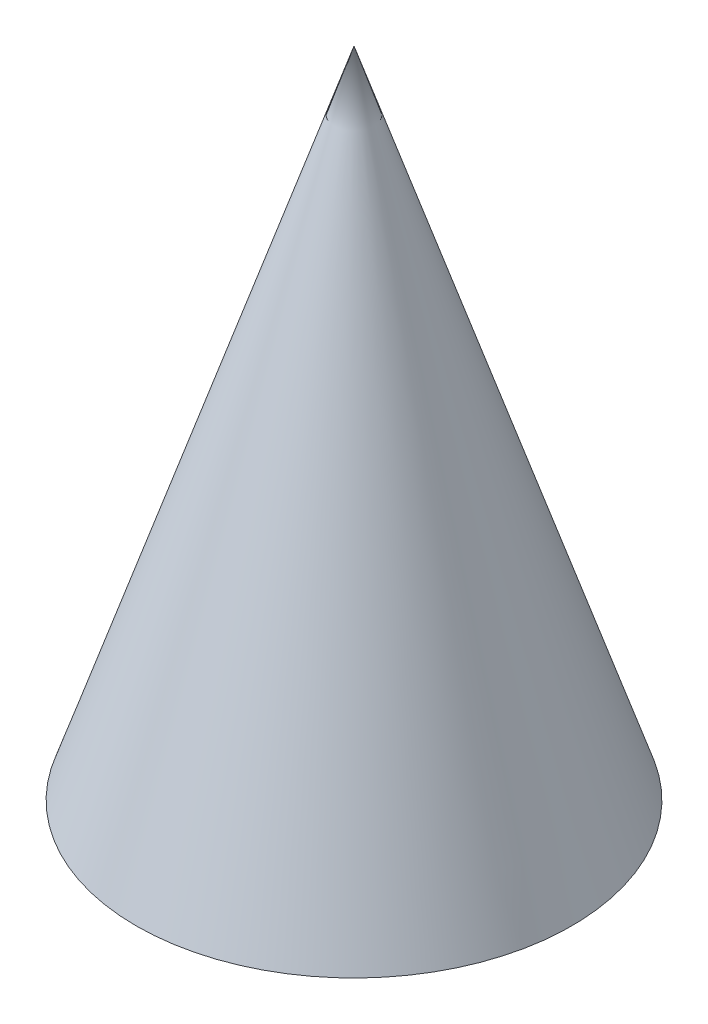
ISO-10303-21;
HEADER;
FILE_DESCRIPTION(('STEP AP214'),'2;1');
FILE_NAME('part.step','',(''),(''),'','','');
FILE_SCHEMA(('AUTOMOTIVE_DESIGN { 1 0 10303 214 1 1 1 1 }'));
ENDSEC;
DATA;
#1=APPLICATION_CONTEXT('core data for automotive mechanical design processes');
#2=APPLICATION_PROTOCOL_DEFINITION('international standard','automotive_design',2000,#1);
#3=PRODUCT_CONTEXT('',#1,'mechanical');
#4=PRODUCT('Part','Part','',(#3));
#5=PRODUCT_RELATED_PRODUCT_CATEGORY('part','',(#4));
#6=PRODUCT_DEFINITION_FORMATION('','',#4);
#7=PRODUCT_DEFINITION_CONTEXT('part definition',#1,'design');
#8=PRODUCT_DEFINITION('design','',#6,#7);
#9=PRODUCT_DEFINITION_SHAPE('','',#8);
#10=(LENGTH_UNIT() NAMED_UNIT(*) SI_UNIT(.MILLI.,.METRE.));
#11=(NAMED_UNIT(*) PLANE_ANGLE_UNIT() SI_UNIT($,.RADIAN.));
#12=(NAMED_UNIT(*) SI_UNIT($,.STERADIAN.) SOLID_ANGLE_UNIT());
#13=UNCERTAINTY_MEASURE_WITH_UNIT(LENGTH_MEASURE(1.E-05),#10,'distance_accuracy_value','');
#14=(GEOMETRIC_REPRESENTATION_CONTEXT(3) GLOBAL_UNCERTAINTY_ASSIGNED_CONTEXT((#13)) GLOBAL_UNIT_ASSIGNED_CONTEXT((#10,
#11,#12)) REPRESENTATION_CONTEXT('',''));
#15=CARTESIAN_POINT('',(0.,0.,0.));
#16=DIRECTION('',(0.,0.,1.));
#17=DIRECTION('',(1.,0.,0.));
#18=AXIS2_PLACEMENT_3D('',#15,#16,#17);
#19=CARTESIAN_POINT('',(0.,0.,0.));
#20=DIRECTION('',(0.,-1.,0.));
#21=DIRECTION('',(0.,0.,-1.));
#22=AXIS2_PLACEMENT_3D('',#19,#20,#21);
#23=CONICAL_SURFACE('',#22,25.,0.321750554396642);
#24=CARTESIAN_POINT('',(0.,75.,0.));
#25=VERTEX_POINT('',#24);
#26=VERTEX_LOOP('',#25);
#27=FACE_BOUND('',#26,.T.);
#28=CARTESIAN_POINT('',(0.,0.,0.));
#29=DIRECTION('',(0.,-1.,0.));
#30=DIRECTION('',(0.,0.,-1.));
#31=AXIS2_PLACEMENT_3D('',#28,#29,#30);
#32=CIRCLE('',#31,25.);
#33=CARTESIAN_POINT('',(0.,0.,-25.));
#34=VERTEX_POINT('',#33);
#35=EDGE_CURVE('E11',#34,#34,#32,.T.);
#36=ORIENTED_EDGE('',*,*,#35,.F.);
#37=EDGE_LOOP('',(#36));
#38=FACE_BOUND('',#37,.T.);
#39=ADVANCED_FACE('F35',(#27,#38),#23,.T.);
#40=CARTESIAN_POINT('',(0.,0.,0.));
#41=DIRECTION('',(0.,-1.,0.));
#42=DIRECTION('',(0.,0.,-1.));
#43=AXIS2_PLACEMENT_3D('',#40,#41,#42);
#44=PLANE('',#43);
#45=ORIENTED_EDGE('',*,*,#35,.T.);
#46=EDGE_LOOP('',(#45));
#47=FACE_BOUND('',#46,.T.);
#48=ADVANCED_FACE('F44',(#47),#44,.T.);
#49=CLOSED_SHELL('',(#39,#48));
#50=MANIFOLD_SOLID_BREP('B2',#49);
#51=ADVANCED_BREP_SHAPE_REPRESENTATION('',(#18,#50),#14);
#52=SHAPE_DEFINITION_REPRESENTATION(#9,#51);
ENDSEC;
END-ISO-10303-21;
